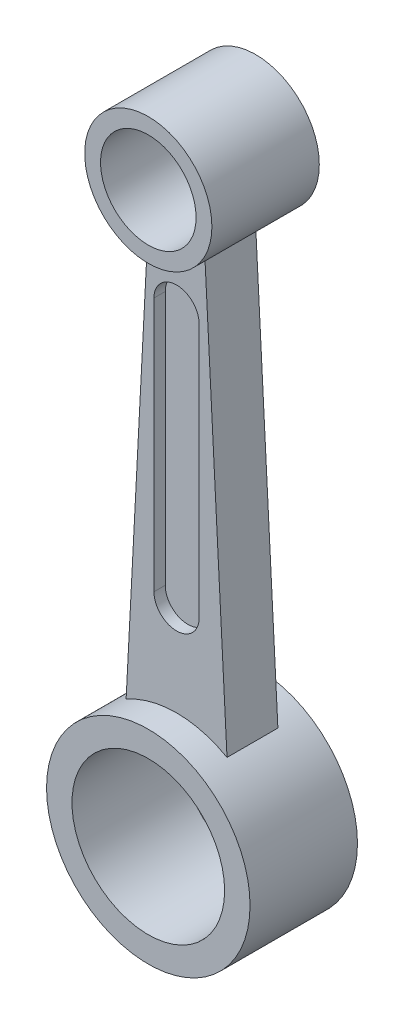
ISO-10303-21;
HEADER;
FILE_DESCRIPTION(('STEP AP214'),'2;1');
FILE_NAME('part.step','',(''),(''),'','','');
FILE_SCHEMA(('AUTOMOTIVE_DESIGN { 1 0 10303 214 1 1 1 1 }'));
ENDSEC;
DATA;
#1=APPLICATION_CONTEXT('core data for automotive mechanical design processes');
#2=APPLICATION_PROTOCOL_DEFINITION('international standard','automotive_design',2000,#1);
#3=PRODUCT_CONTEXT('',#1,'mechanical');
#4=PRODUCT('Part','Part','',(#3));
#5=PRODUCT_RELATED_PRODUCT_CATEGORY('part','',(#4));
#6=PRODUCT_DEFINITION_FORMATION('','',#4);
#7=PRODUCT_DEFINITION_CONTEXT('part definition',#1,'design');
#8=PRODUCT_DEFINITION('design','',#6,#7);
#9=PRODUCT_DEFINITION_SHAPE('','',#8);
#10=(LENGTH_UNIT() NAMED_UNIT(*) SI_UNIT(.MILLI.,.METRE.));
#11=(NAMED_UNIT(*) PLANE_ANGLE_UNIT() SI_UNIT($,.RADIAN.));
#12=(NAMED_UNIT(*) SI_UNIT($,.STERADIAN.) SOLID_ANGLE_UNIT());
#13=UNCERTAINTY_MEASURE_WITH_UNIT(LENGTH_MEASURE(1.E-05),#10,'distance_accuracy_value','');
#14=(GEOMETRIC_REPRESENTATION_CONTEXT(3) GLOBAL_UNCERTAINTY_ASSIGNED_CONTEXT((#13)) GLOBAL_UNIT_ASSIGNED_CONTEXT((#10,
#11,#12)) REPRESENTATION_CONTEXT('',''));
#15=CARTESIAN_POINT('',(0.,0.,0.));
#16=DIRECTION('',(0.,0.,1.));
#17=DIRECTION('',(1.,0.,0.));
#18=AXIS2_PLACEMENT_3D('',#15,#16,#17);
#19=CARTESIAN_POINT('',(0.,0.,-9.));
#20=DIRECTION('',(0.,0.,1.));
#21=DIRECTION('',(1.,0.,0.));
#22=AXIS2_PLACEMENT_3D('',#19,#20,#21);
#23=PLANE('',#22);
#24=CARTESIAN_POINT('',(0.,-201.2,-9.));
#25=DIRECTION('',(0.,0.,1.));
#26=DIRECTION('',(1.,0.,0.));
#27=AXIS2_PLACEMENT_3D('',#24,#25,#26);
#28=CIRCLE('',#27,36.);
#29=CARTESIAN_POINT('',(17.8496972125887,-169.93678984143,-9.));
#30=VERTEX_POINT('',#29);
#31=CARTESIAN_POINT('',(-17.8496972125887,-169.93678984143,-9.));
#32=VERTEX_POINT('',#31);
#33=EDGE_CURVE('E239',#30,#32,#28,.T.);
#34=ORIENTED_EDGE('',*,*,#33,.T.);
#35=DIRECTION('',(-0.0523359562429438,-0.998629534754574,0.));
#36=VECTOR('',#35,1.);
#37=CARTESIAN_POINT('',(-8.91919021071964,0.467434951946856,-9.));
#38=LINE('',#37,#36);
#39=CARTESIAN_POINT('',(-10.,-20.1556443707464,-9.));
#40=VERTEX_POINT('',#39);
#41=EDGE_CURVE('E250',#40,#32,#38,.T.);
#42=ORIENTED_EDGE('',*,*,#41,.F.);
#43=CARTESIAN_POINT('',(0.,0.,-9.));
#44=DIRECTION('',(0.,0.,1.));
#45=DIRECTION('',(1.,0.,0.));
#46=AXIS2_PLACEMENT_3D('',#43,#44,#45);
#47=CIRCLE('',#46,22.5);
#48=CARTESIAN_POINT('',(10.,-20.1556443707464,-9.));
#49=VERTEX_POINT('',#48);
#50=EDGE_CURVE('E269',#40,#49,#47,.T.);
#51=ORIENTED_EDGE('',*,*,#50,.T.);
#52=DIRECTION('',(0.052335956242944,-0.998629534754574,0.));
#53=VECTOR('',#52,1.);
#54=CARTESIAN_POINT('',(8.91919021071964,0.467434951946858,-9.));
#55=LINE('',#54,#53);
#56=EDGE_CURVE('E265',#49,#30,#55,.T.);
#57=ORIENTED_EDGE('',*,*,#56,.T.);
#58=EDGE_LOOP('',(#34,#42,#51,#57));
#59=FACE_BOUND('',#58,.T.);
#60=CARTESIAN_POINT('',(0.,-132.1,-9.));
#61=DIRECTION('',(0.,0.,1.));
#62=DIRECTION('',(1.,0.,0.));
#63=AXIS2_PLACEMENT_3D('',#60,#61,#62);
#64=CIRCLE('',#63,8.);
#65=CARTESIAN_POINT('',(-8.,-132.1,-9.));
#66=VERTEX_POINT('',#65);
#67=CARTESIAN_POINT('',(8.,-132.1,-9.));
#68=VERTEX_POINT('',#67);
#69=EDGE_CURVE('E63',#66,#68,#64,.T.);
#70=ORIENTED_EDGE('',*,*,#69,.T.);
#71=DIRECTION('',(0.,1.,0.));
#72=VECTOR('',#71,1.);
#73=CARTESIAN_POINT('',(8.,-132.1,-9.));
#74=LINE('',#73,#72);
#75=CARTESIAN_POINT('',(8.00000000000001,-42.1,-9.));
#76=VERTEX_POINT('',#75);
#77=EDGE_CURVE('E160',#68,#76,#74,.T.);
#78=ORIENTED_EDGE('',*,*,#77,.T.);
#79=CARTESIAN_POINT('',(0.,-42.1,-9.));
#80=DIRECTION('',(0.,0.,1.));
#81=DIRECTION('',(1.,0.,0.));
#82=AXIS2_PLACEMENT_3D('',#79,#80,#81);
#83=CIRCLE('',#82,8.);
#84=CARTESIAN_POINT('',(-7.99999999999999,-42.1,-9.));
#85=VERTEX_POINT('',#84);
#86=EDGE_CURVE('E164',#76,#85,#83,.T.);
#87=ORIENTED_EDGE('',*,*,#86,.T.);
#88=DIRECTION('',(0.,-1.,0.));
#89=VECTOR('',#88,1.);
#90=CARTESIAN_POINT('',(-8.,-132.1,-9.));
#91=LINE('',#90,#89);
#92=EDGE_CURVE('E173',#85,#66,#91,.T.);
#93=ORIENTED_EDGE('',*,*,#92,.T.);
#94=EDGE_LOOP('',(#70,#78,#87,#93));
#95=FACE_BOUND('',#94,.T.);
#96=ADVANCED_FACE('F45',(#59,#95),#23,.F.);
#97=CARTESIAN_POINT('',(0.,0.,19.));
#98=DIRECTION('',(0.,0.,-1.));
#99=DIRECTION('',(-1.,0.,0.));
#100=AXIS2_PLACEMENT_3D('',#97,#98,#99);
#101=CYLINDRICAL_SURFACE('',#100,22.5);
#102=DIRECTION('',(0.,0.,-1.));
#103=VECTOR('',#102,1.);
#104=CARTESIAN_POINT('',(-10.,-20.1556443707464,9.));
#105=LINE('',#104,#103);
#106=CARTESIAN_POINT('',(-10.,-20.1556443707464,9.));
#107=VERTEX_POINT('',#106);
#108=EDGE_CURVE('E278',#107,#40,#105,.T.);
#109=ORIENTED_EDGE('',*,*,#108,.F.);
#110=CARTESIAN_POINT('',(0.,0.,9.));
#111=DIRECTION('',(0.,0.,1.));
#112=DIRECTION('',(1.,0.,0.));
#113=AXIS2_PLACEMENT_3D('',#110,#111,#112);
#114=CIRCLE('',#113,22.5);
#115=CARTESIAN_POINT('',(10.,-20.1556443707464,9.));
#116=VERTEX_POINT('',#115);
#117=EDGE_CURVE('E254',#107,#116,#114,.T.);
#118=ORIENTED_EDGE('',*,*,#117,.T.);
#119=DIRECTION('',(0.,0.,-1.));
#120=VECTOR('',#119,1.);
#121=CARTESIAN_POINT('',(10.,-20.1556443707464,9.));
#122=LINE('',#121,#120);
#123=EDGE_CURVE('E282',#116,#49,#122,.T.);
#124=ORIENTED_EDGE('',*,*,#123,.T.);
#125=ORIENTED_EDGE('',*,*,#50,.F.);
#126=EDGE_LOOP('',(#109,#118,#124,#125));
#127=FACE_BOUND('',#126,.T.);
#128=CARTESIAN_POINT('',(0.,0.,19.));
#129=DIRECTION('',(0.,0.,1.));
#130=DIRECTION('',(1.,0.,0.));
#131=AXIS2_PLACEMENT_3D('',#128,#129,#130);
#132=CIRCLE('',#131,22.5);
#133=CARTESIAN_POINT('',(22.5,0.,19.));
#134=VERTEX_POINT('',#133);
#135=EDGE_CURVE('E55',#134,#134,#132,.T.);
#136=ORIENTED_EDGE('',*,*,#135,.F.);
#137=EDGE_LOOP('',(#136));
#138=FACE_BOUND('',#137,.T.);
#139=CARTESIAN_POINT('',(0.,0.,-19.));
#140=DIRECTION('',(0.,0.,1.));
#141=DIRECTION('',(1.,0.,0.));
#142=AXIS2_PLACEMENT_3D('',#139,#140,#141);
#143=CIRCLE('',#142,22.5);
#144=CARTESIAN_POINT('',(22.5,0.,-19.));
#145=VERTEX_POINT('',#144);
#146=EDGE_CURVE('E289',#145,#145,#143,.T.);
#147=ORIENTED_EDGE('',*,*,#146,.T.);
#148=EDGE_LOOP('',(#147));
#149=FACE_BOUND('',#148,.T.);
#150=ADVANCED_FACE('F47',(#127,#138,#149),#101,.T.);
#151=CARTESIAN_POINT('',(0.,0.,19.));
#152=DIRECTION('',(0.,0.,-1.));
#153=DIRECTION('',(-1.,0.,0.));
#154=AXIS2_PLACEMENT_3D('',#151,#152,#153);
#155=CYLINDRICAL_SURFACE('',#154,16.9);
#156=CARTESIAN_POINT('',(0.,0.,19.));
#157=DIRECTION('',(0.,0.,1.));
#158=DIRECTION('',(1.,0.,0.));
#159=AXIS2_PLACEMENT_3D('',#156,#157,#158);
#160=CIRCLE('',#159,16.9);
#161=CARTESIAN_POINT('',(16.9,0.,19.));
#162=VERTEX_POINT('',#161);
#163=EDGE_CURVE('E11',#162,#162,#160,.T.);
#164=ORIENTED_EDGE('',*,*,#163,.T.);
#165=EDGE_LOOP('',(#164));
#166=FACE_BOUND('',#165,.T.);
#167=CARTESIAN_POINT('',(0.,0.,-19.));
#168=DIRECTION('',(0.,0.,1.));
#169=DIRECTION('',(1.,0.,0.));
#170=AXIS2_PLACEMENT_3D('',#167,#168,#169);
#171=CIRCLE('',#170,16.9);
#172=CARTESIAN_POINT('',(16.9,0.,-19.));
#173=VERTEX_POINT('',#172);
#174=EDGE_CURVE('E49',#173,#173,#171,.T.);
#175=ORIENTED_EDGE('',*,*,#174,.F.);
#176=EDGE_LOOP('',(#175));
#177=FACE_BOUND('',#176,.T.);
#178=ADVANCED_FACE('F302',(#166,#177),#155,.F.);
#179=CARTESIAN_POINT('',(0.,0.,19.));
#180=DIRECTION('',(0.,0.,1.));
#181=DIRECTION('',(1.,0.,0.));
#182=AXIS2_PLACEMENT_3D('',#179,#180,#181);
#183=PLANE('',#182);
#184=ORIENTED_EDGE('',*,*,#135,.T.);
#185=EDGE_LOOP('',(#184));
#186=FACE_BOUND('',#185,.T.);
#187=ORIENTED_EDGE('',*,*,#163,.F.);
#188=EDGE_LOOP('',(#187));
#189=FACE_BOUND('',#188,.T.);
#190=ADVANCED_FACE('F304',(#186,#189),#183,.T.);
#191=CARTESIAN_POINT('',(0.,0.,-19.));
#192=DIRECTION('',(0.,0.,1.));
#193=DIRECTION('',(1.,0.,0.));
#194=AXIS2_PLACEMENT_3D('',#191,#192,#193);
#195=PLANE('',#194);
#196=ORIENTED_EDGE('',*,*,#146,.F.);
#197=EDGE_LOOP('',(#196));
#198=FACE_BOUND('',#197,.T.);
#199=ORIENTED_EDGE('',*,*,#174,.T.);
#200=EDGE_LOOP('',(#199));
#201=FACE_BOUND('',#200,.T.);
#202=ADVANCED_FACE('F300',(#198,#201),#195,.F.);
#203=CARTESIAN_POINT('',(8.91919021071964,0.467434951946858,9.));
#204=DIRECTION('',(0.998629534754574,0.052335956242944,0.));
#205=DIRECTION('',(-0.052335956242944,0.998629534754574,0.));
#206=AXIS2_PLACEMENT_3D('',#203,#204,#205);
#207=PLANE('',#206);
#208=ORIENTED_EDGE('',*,*,#56,.F.);
#209=ORIENTED_EDGE('',*,*,#123,.F.);
#210=DIRECTION('',(0.052335956242944,-0.998629534754574,0.));
#211=VECTOR('',#210,1.);
#212=CARTESIAN_POINT('',(8.91919021071964,0.467434951946858,9.));
#213=LINE('',#212,#211);
#214=CARTESIAN_POINT('',(17.8496972125887,-169.93678984143,9.));
#215=VERTEX_POINT('',#214);
#216=EDGE_CURVE('E249',#116,#215,#213,.T.);
#217=ORIENTED_EDGE('',*,*,#216,.T.);
#218=DIRECTION('',(0.,0.,-1.));
#219=VECTOR('',#218,1.);
#220=CARTESIAN_POINT('',(17.8496972125887,-169.93678984143,9.));
#221=LINE('',#220,#219);
#222=EDGE_CURVE('E285',#215,#30,#221,.T.);
#223=ORIENTED_EDGE('',*,*,#222,.T.);
#224=EDGE_LOOP('',(#208,#209,#217,#223));
#225=FACE_BOUND('',#224,.T.);
#226=ADVANCED_FACE('F329',(#225),#207,.T.);
#227=CARTESIAN_POINT('',(-8.91919021071964,0.467434951946856,9.));
#228=DIRECTION('',(0.998629534754574,-0.0523359562429438,0.));
#229=DIRECTION('',(0.0523359562429438,0.998629534754574,0.));
#230=AXIS2_PLACEMENT_3D('',#227,#228,#229);
#231=PLANE('',#230);
#232=ORIENTED_EDGE('',*,*,#41,.T.);
#233=DIRECTION('',(0.,0.,-1.));
#234=VECTOR('',#233,1.);
#235=CARTESIAN_POINT('',(-17.8496972125887,-169.93678984143,9.));
#236=LINE('',#235,#234);
#237=CARTESIAN_POINT('',(-17.8496972125887,-169.93678984143,9.));
#238=VERTEX_POINT('',#237);
#239=EDGE_CURVE('E261',#238,#32,#236,.T.);
#240=ORIENTED_EDGE('',*,*,#239,.F.);
#241=DIRECTION('',(-0.0523359562429438,-0.998629534754574,0.));
#242=VECTOR('',#241,1.);
#243=CARTESIAN_POINT('',(-8.91919021071964,0.467434951946856,9.));
#244=LINE('',#243,#242);
#245=EDGE_CURVE('E257',#107,#238,#244,.T.);
#246=ORIENTED_EDGE('',*,*,#245,.F.);
#247=ORIENTED_EDGE('',*,*,#108,.T.);
#248=EDGE_LOOP('',(#232,#240,#246,#247));
#249=FACE_BOUND('',#248,.T.);
#250=ADVANCED_FACE('F326',(#249),#231,.F.);
#251=CARTESIAN_POINT('',(0.,0.,9.));
#252=DIRECTION('',(0.,0.,1.));
#253=DIRECTION('',(1.,0.,0.));
#254=AXIS2_PLACEMENT_3D('',#251,#252,#253);
#255=PLANE('',#254);
#256=CARTESIAN_POINT('',(0.,-132.1,9.));
#257=DIRECTION('',(0.,0.,1.));
#258=DIRECTION('',(1.,0.,0.));
#259=AXIS2_PLACEMENT_3D('',#256,#257,#258);
#260=CIRCLE('',#259,8.);
#261=CARTESIAN_POINT('',(-8.,-132.1,9.));
#262=VERTEX_POINT('',#261);
#263=CARTESIAN_POINT('',(8.,-132.1,9.));
#264=VERTEX_POINT('',#263);
#265=EDGE_CURVE('E71',#262,#264,#260,.T.);
#266=ORIENTED_EDGE('',*,*,#265,.F.);
#267=DIRECTION('',(0.,-1.,0.));
#268=VECTOR('',#267,1.);
#269=CARTESIAN_POINT('',(-8.,-132.1,9.));
#270=LINE('',#269,#268);
#271=CARTESIAN_POINT('',(-7.99999999999999,-42.1,9.));
#272=VERTEX_POINT('',#271);
#273=EDGE_CURVE('E192',#272,#262,#270,.T.);
#274=ORIENTED_EDGE('',*,*,#273,.F.);
#275=CARTESIAN_POINT('',(0.,-42.1,9.));
#276=DIRECTION('',(0.,0.,1.));
#277=DIRECTION('',(1.,0.,0.));
#278=AXIS2_PLACEMENT_3D('',#275,#276,#277);
#279=CIRCLE('',#278,8.);
#280=CARTESIAN_POINT('',(8.00000000000001,-42.1,9.));
#281=VERTEX_POINT('',#280);
#282=EDGE_CURVE('E211',#281,#272,#279,.T.);
#283=ORIENTED_EDGE('',*,*,#282,.F.);
#284=DIRECTION('',(0.,1.,0.));
#285=VECTOR('',#284,1.);
#286=CARTESIAN_POINT('',(8.,-132.1,9.));
#287=LINE('',#286,#285);
#288=EDGE_CURVE('E207',#264,#281,#287,.T.);
#289=ORIENTED_EDGE('',*,*,#288,.F.);
#290=EDGE_LOOP('',(#266,#274,#283,#289));
#291=FACE_BOUND('',#290,.T.);
#292=CARTESIAN_POINT('',(0.,-201.2,9.));
#293=DIRECTION('',(0.,0.,1.));
#294=DIRECTION('',(1.,0.,0.));
#295=AXIS2_PLACEMENT_3D('',#292,#293,#294);
#296=CIRCLE('',#295,36.);
#297=EDGE_CURVE('E246',#215,#238,#296,.T.);
#298=ORIENTED_EDGE('',*,*,#297,.F.);
#299=ORIENTED_EDGE('',*,*,#216,.F.);
#300=ORIENTED_EDGE('',*,*,#117,.F.);
#301=ORIENTED_EDGE('',*,*,#245,.T.);
#302=EDGE_LOOP('',(#298,#299,#300,#301));
#303=FACE_BOUND('',#302,.T.);
#304=ADVANCED_FACE('F324',(#291,#303),#255,.T.);
#305=CARTESIAN_POINT('',(0.,-201.2,19.));
#306=DIRECTION('',(0.,0.,-1.));
#307=DIRECTION('',(-1.,0.,0.));
#308=AXIS2_PLACEMENT_3D('',#305,#306,#307);
#309=CYLINDRICAL_SURFACE('',#308,27.);
#310=CARTESIAN_POINT('',(0.,-201.2,19.));
#311=DIRECTION('',(0.,0.,1.));
#312=DIRECTION('',(1.,0.,0.));
#313=AXIS2_PLACEMENT_3D('',#310,#311,#312);
#314=CIRCLE('',#313,27.);
#315=CARTESIAN_POINT('',(27.,-201.2,19.));
#316=VERTEX_POINT('',#315);
#317=EDGE_CURVE('E230',#316,#316,#314,.T.);
#318=ORIENTED_EDGE('',*,*,#317,.T.);
#319=EDGE_LOOP('',(#318));
#320=FACE_BOUND('',#319,.T.);
#321=CARTESIAN_POINT('',(0.,-201.2,-19.));
#322=DIRECTION('',(0.,0.,1.));
#323=DIRECTION('',(1.,0.,0.));
#324=AXIS2_PLACEMENT_3D('',#321,#322,#323);
#325=CIRCLE('',#324,27.);
#326=CARTESIAN_POINT('',(27.,-201.2,-19.));
#327=VERTEX_POINT('',#326);
#328=EDGE_CURVE('E221',#327,#327,#325,.T.);
#329=ORIENTED_EDGE('',*,*,#328,.F.);
#330=EDGE_LOOP('',(#329));
#331=FACE_BOUND('',#330,.T.);
#332=ADVANCED_FACE('F361',(#320,#331),#309,.F.);
#333=CARTESIAN_POINT('',(0.,-201.2,19.));
#334=DIRECTION('',(0.,0.,-1.));
#335=DIRECTION('',(-1.,0.,0.));
#336=AXIS2_PLACEMENT_3D('',#333,#334,#335);
#337=CYLINDRICAL_SURFACE('',#336,36.);
#338=ORIENTED_EDGE('',*,*,#297,.T.);
#339=ORIENTED_EDGE('',*,*,#239,.T.);
#340=ORIENTED_EDGE('',*,*,#33,.F.);
#341=ORIENTED_EDGE('',*,*,#222,.F.);
#342=EDGE_LOOP('',(#338,#339,#340,#341));
#343=FACE_BOUND('',#342,.T.);
#344=CARTESIAN_POINT('',(0.,-201.2,19.));
#345=DIRECTION('',(0.,0.,1.));
#346=DIRECTION('',(1.,0.,0.));
#347=AXIS2_PLACEMENT_3D('',#344,#345,#346);
#348=CIRCLE('',#347,36.);
#349=CARTESIAN_POINT('',(36.,-201.2,19.));
#350=VERTEX_POINT('',#349);
#351=EDGE_CURVE('E234',#350,#350,#348,.T.);
#352=ORIENTED_EDGE('',*,*,#351,.F.);
#353=EDGE_LOOP('',(#352));
#354=FACE_BOUND('',#353,.T.);
#355=CARTESIAN_POINT('',(0.,-201.2,-19.));
#356=DIRECTION('',(0.,0.,1.));
#357=DIRECTION('',(1.,0.,0.));
#358=AXIS2_PLACEMENT_3D('',#355,#356,#357);
#359=CIRCLE('',#358,36.);
#360=CARTESIAN_POINT('',(36.,-201.2,-19.));
#361=VERTEX_POINT('',#360);
#362=EDGE_CURVE('E235',#361,#361,#359,.T.);
#363=ORIENTED_EDGE('',*,*,#362,.T.);
#364=EDGE_LOOP('',(#363));
#365=FACE_BOUND('',#364,.T.);
#366=ADVANCED_FACE('F365',(#343,#354,#365),#337,.T.);
#367=CARTESIAN_POINT('',(0.,0.,19.));
#368=DIRECTION('',(0.,0.,1.));
#369=DIRECTION('',(1.,0.,0.));
#370=AXIS2_PLACEMENT_3D('',#367,#368,#369);
#371=PLANE('',#370);
#372=ORIENTED_EDGE('',*,*,#317,.F.);
#373=EDGE_LOOP('',(#372));
#374=FACE_BOUND('',#373,.T.);
#375=ORIENTED_EDGE('',*,*,#351,.T.);
#376=EDGE_LOOP('',(#375));
#377=FACE_BOUND('',#376,.T.);
#378=ADVANCED_FACE('F371',(#374,#377),#371,.T.);
#379=CARTESIAN_POINT('',(0.,0.,-19.));
#380=DIRECTION('',(0.,0.,1.));
#381=DIRECTION('',(1.,0.,0.));
#382=AXIS2_PLACEMENT_3D('',#379,#380,#381);
#383=PLANE('',#382);
#384=ORIENTED_EDGE('',*,*,#328,.T.);
#385=EDGE_LOOP('',(#384));
#386=FACE_BOUND('',#385,.T.);
#387=ORIENTED_EDGE('',*,*,#362,.F.);
#388=EDGE_LOOP('',(#387));
#389=FACE_BOUND('',#388,.T.);
#390=ADVANCED_FACE('F379',(#386,#389),#383,.F.);
#391=CARTESIAN_POINT('',(0.,-132.1,5.));
#392=DIRECTION('',(0.,0.,1.));
#393=DIRECTION('',(1.,0.,0.));
#394=AXIS2_PLACEMENT_3D('',#391,#392,#393);
#395=CYLINDRICAL_SURFACE('',#394,8.);
#396=ORIENTED_EDGE('',*,*,#265,.T.);
#397=DIRECTION('',(0.,0.,1.));
#398=VECTOR('',#397,1.);
#399=CARTESIAN_POINT('',(8.,-132.1,5.));
#400=LINE('',#399,#398);
#401=CARTESIAN_POINT('',(8.,-132.1,5.));
#402=VERTEX_POINT('',#401);
#403=EDGE_CURVE('E204',#402,#264,#400,.T.);
#404=ORIENTED_EDGE('',*,*,#403,.F.);
#405=CARTESIAN_POINT('',(0.,-132.1,5.));
#406=DIRECTION('',(0.,0.,1.));
#407=DIRECTION('',(1.,0.,0.));
#408=AXIS2_PLACEMENT_3D('',#405,#406,#407);
#409=CIRCLE('',#408,8.);
#410=CARTESIAN_POINT('',(-8.,-132.1,5.));
#411=VERTEX_POINT('',#410);
#412=EDGE_CURVE('E187',#411,#402,#409,.T.);
#413=ORIENTED_EDGE('',*,*,#412,.F.);
#414=DIRECTION('',(0.,0.,1.));
#415=VECTOR('',#414,1.);
#416=CARTESIAN_POINT('',(-8.,-132.1,5.));
#417=LINE('',#416,#415);
#418=EDGE_CURVE('E218',#411,#262,#417,.T.);
#419=ORIENTED_EDGE('',*,*,#418,.T.);
#420=EDGE_LOOP('',(#396,#404,#413,#419));
#421=FACE_BOUND('',#420,.T.);
#422=ADVANCED_FACE('F387',(#421),#395,.F.);
#423=CARTESIAN_POINT('',(-8.,-132.1,5.));
#424=DIRECTION('',(-1.,0.,0.));
#425=DIRECTION('',(0.,-1.,0.));
#426=AXIS2_PLACEMENT_3D('',#423,#424,#425);
#427=PLANE('',#426);
#428=ORIENTED_EDGE('',*,*,#273,.T.);
#429=ORIENTED_EDGE('',*,*,#418,.F.);
#430=DIRECTION('',(0.,-1.,0.));
#431=VECTOR('',#430,1.);
#432=CARTESIAN_POINT('',(-8.,-132.1,5.));
#433=LINE('',#432,#431);
#434=CARTESIAN_POINT('',(-7.99999999999999,-42.1,5.));
#435=VERTEX_POINT('',#434);
#436=EDGE_CURVE('E200',#435,#411,#433,.T.);
#437=ORIENTED_EDGE('',*,*,#436,.F.);
#438=DIRECTION('',(0.,0.,1.));
#439=VECTOR('',#438,1.);
#440=CARTESIAN_POINT('',(-7.99999999999999,-42.1,5.));
#441=LINE('',#440,#439);
#442=EDGE_CURVE('E222',#435,#272,#441,.T.);
#443=ORIENTED_EDGE('',*,*,#442,.T.);
#444=EDGE_LOOP('',(#428,#429,#437,#443));
#445=FACE_BOUND('',#444,.T.);
#446=ADVANCED_FACE('F400',(#445),#427,.F.);
#447=CARTESIAN_POINT('',(0.,-42.1,5.));
#448=DIRECTION('',(0.,0.,1.));
#449=DIRECTION('',(1.,0.,0.));
#450=AXIS2_PLACEMENT_3D('',#447,#448,#449);
#451=CYLINDRICAL_SURFACE('',#450,8.);
#452=ORIENTED_EDGE('',*,*,#282,.T.);
#453=ORIENTED_EDGE('',*,*,#442,.F.);
#454=CARTESIAN_POINT('',(0.,-42.1,5.));
#455=DIRECTION('',(0.,0.,1.));
#456=DIRECTION('',(1.,0.,0.));
#457=AXIS2_PLACEMENT_3D('',#454,#455,#456);
#458=CIRCLE('',#457,8.);
#459=CARTESIAN_POINT('',(8.00000000000001,-42.1,5.));
#460=VERTEX_POINT('',#459);
#461=EDGE_CURVE('E196',#460,#435,#458,.T.);
#462=ORIENTED_EDGE('',*,*,#461,.F.);
#463=DIRECTION('',(0.,0.,1.));
#464=VECTOR('',#463,1.);
#465=CARTESIAN_POINT('',(8.00000000000001,-42.1,5.));
#466=LINE('',#465,#464);
#467=EDGE_CURVE('E225',#460,#281,#466,.T.);
#468=ORIENTED_EDGE('',*,*,#467,.T.);
#469=EDGE_LOOP('',(#452,#453,#462,#468));
#470=FACE_BOUND('',#469,.T.);
#471=ADVANCED_FACE('F408',(#470),#451,.F.);
#472=CARTESIAN_POINT('',(8.,-132.1,5.));
#473=DIRECTION('',(1.,0.,0.));
#474=DIRECTION('',(0.,1.,0.));
#475=AXIS2_PLACEMENT_3D('',#472,#473,#474);
#476=PLANE('',#475);
#477=ORIENTED_EDGE('',*,*,#288,.T.);
#478=ORIENTED_EDGE('',*,*,#467,.F.);
#479=DIRECTION('',(0.,1.,0.));
#480=VECTOR('',#479,1.);
#481=CARTESIAN_POINT('',(8.,-132.1,5.));
#482=LINE('',#481,#480);
#483=EDGE_CURVE('E191',#402,#460,#482,.T.);
#484=ORIENTED_EDGE('',*,*,#483,.F.);
#485=ORIENTED_EDGE('',*,*,#403,.T.);
#486=EDGE_LOOP('',(#477,#478,#484,#485));
#487=FACE_BOUND('',#486,.T.);
#488=ADVANCED_FACE('F417',(#487),#476,.F.);
#489=CARTESIAN_POINT('',(0.,-132.1,5.));
#490=DIRECTION('',(0.,0.,1.));
#491=DIRECTION('',(1.,0.,0.));
#492=AXIS2_PLACEMENT_3D('',#489,#490,#491);
#493=PLANE('',#492);
#494=ORIENTED_EDGE('',*,*,#412,.T.);
#495=ORIENTED_EDGE('',*,*,#483,.T.);
#496=ORIENTED_EDGE('',*,*,#461,.T.);
#497=ORIENTED_EDGE('',*,*,#436,.T.);
#498=EDGE_LOOP('',(#494,#495,#496,#497));
#499=FACE_BOUND('',#498,.T.);
#500=ADVANCED_FACE('F425',(#499),#493,.T.);
#501=CARTESIAN_POINT('',(0.,-132.1,-5.));
#502=DIRECTION('',(0.,0.,-1.));
#503=DIRECTION('',(-1.,0.,0.));
#504=AXIS2_PLACEMENT_3D('',#501,#502,#503);
#505=CYLINDRICAL_SURFACE('',#504,8.);
#506=ORIENTED_EDGE('',*,*,#69,.F.);
#507=DIRECTION('',(0.,0.,-1.));
#508=VECTOR('',#507,1.);
#509=CARTESIAN_POINT('',(-8.,-132.1,-5.));
#510=LINE('',#509,#508);
#511=CARTESIAN_POINT('',(-8.,-132.1,-5.));
#512=VERTEX_POINT('',#511);
#513=EDGE_CURVE('E142',#512,#66,#510,.T.);
#514=ORIENTED_EDGE('',*,*,#513,.F.);
#515=CARTESIAN_POINT('',(0.,-132.1,-5.));
#516=DIRECTION('',(0.,0.,1.));
#517=DIRECTION('',(1.,0.,0.));
#518=AXIS2_PLACEMENT_3D('',#515,#516,#517);
#519=CIRCLE('',#518,8.);
#520=CARTESIAN_POINT('',(8.,-132.1,-5.));
#521=VERTEX_POINT('',#520);
#522=EDGE_CURVE('E150',#512,#521,#519,.T.);
#523=ORIENTED_EDGE('',*,*,#522,.T.);
#524=DIRECTION('',(0.,0.,-1.));
#525=VECTOR('',#524,1.);
#526=CARTESIAN_POINT('',(8.,-132.1,-5.));
#527=LINE('',#526,#525);
#528=EDGE_CURVE('E179',#521,#68,#527,.T.);
#529=ORIENTED_EDGE('',*,*,#528,.T.);
#530=EDGE_LOOP('',(#506,#514,#523,#529));
#531=FACE_BOUND('',#530,.T.);
#532=ADVANCED_FACE('F153',(#531),#505,.F.);
#533=CARTESIAN_POINT('',(8.,-132.1,-5.));
#534=DIRECTION('',(-1.,0.,0.));
#535=DIRECTION('',(0.,-1.,0.));
#536=AXIS2_PLACEMENT_3D('',#533,#534,#535);
#537=PLANE('',#536);
#538=ORIENTED_EDGE('',*,*,#77,.F.);
#539=ORIENTED_EDGE('',*,*,#528,.F.);
#540=DIRECTION('',(0.,1.,0.));
#541=VECTOR('',#540,1.);
#542=CARTESIAN_POINT('',(8.,-132.1,-5.));
#543=LINE('',#542,#541);
#544=CARTESIAN_POINT('',(8.00000000000001,-42.1,-5.));
#545=VERTEX_POINT('',#544);
#546=EDGE_CURVE('E156',#521,#545,#543,.T.);
#547=ORIENTED_EDGE('',*,*,#546,.T.);
#548=DIRECTION('',(0.,0.,-1.));
#549=VECTOR('',#548,1.);
#550=CARTESIAN_POINT('',(8.00000000000001,-42.1,-5.));
#551=LINE('',#550,#549);
#552=EDGE_CURVE('E182',#545,#76,#551,.T.);
#553=ORIENTED_EDGE('',*,*,#552,.T.);
#554=EDGE_LOOP('',(#538,#539,#547,#553));
#555=FACE_BOUND('',#554,.T.);
#556=ADVANCED_FACE('F451',(#555),#537,.T.);
#557=CARTESIAN_POINT('',(0.,-42.1,-5.));
#558=DIRECTION('',(0.,0.,-1.));
#559=DIRECTION('',(-1.,0.,0.));
#560=AXIS2_PLACEMENT_3D('',#557,#558,#559);
#561=CYLINDRICAL_SURFACE('',#560,8.);
#562=ORIENTED_EDGE('',*,*,#86,.F.);
#563=ORIENTED_EDGE('',*,*,#552,.F.);
#564=CARTESIAN_POINT('',(0.,-42.1,-5.));
#565=DIRECTION('',(0.,0.,1.));
#566=DIRECTION('',(1.,0.,0.));
#567=AXIS2_PLACEMENT_3D('',#564,#565,#566);
#568=CIRCLE('',#567,8.);
#569=CARTESIAN_POINT('',(-7.99999999999999,-42.1,-5.));
#570=VERTEX_POINT('',#569);
#571=EDGE_CURVE('E149',#545,#570,#568,.T.);
#572=ORIENTED_EDGE('',*,*,#571,.T.);
#573=DIRECTION('',(0.,0.,-1.));
#574=VECTOR('',#573,1.);
#575=CARTESIAN_POINT('',(-7.99999999999999,-42.1,-5.));
#576=LINE('',#575,#574);
#577=EDGE_CURVE('E144',#570,#85,#576,.T.);
#578=ORIENTED_EDGE('',*,*,#577,.T.);
#579=EDGE_LOOP('',(#562,#563,#572,#578));
#580=FACE_BOUND('',#579,.T.);
#581=ADVANCED_FACE('F460',(#580),#561,.F.);
#582=CARTESIAN_POINT('',(-8.,-132.1,-5.));
#583=DIRECTION('',(1.,0.,0.));
#584=DIRECTION('',(0.,1.,0.));
#585=AXIS2_PLACEMENT_3D('',#582,#583,#584);
#586=PLANE('',#585);
#587=ORIENTED_EDGE('',*,*,#92,.F.);
#588=ORIENTED_EDGE('',*,*,#577,.F.);
#589=DIRECTION('',(0.,-1.,0.));
#590=VECTOR('',#589,1.);
#591=CARTESIAN_POINT('',(-8.,-132.1,-5.));
#592=LINE('',#591,#590);
#593=EDGE_CURVE('E139',#570,#512,#592,.T.);
#594=ORIENTED_EDGE('',*,*,#593,.T.);
#595=ORIENTED_EDGE('',*,*,#513,.T.);
#596=EDGE_LOOP('',(#587,#588,#594,#595));
#597=FACE_BOUND('',#596,.T.);
#598=ADVANCED_FACE('F141',(#597),#586,.T.);
#599=CARTESIAN_POINT('',(0.,-132.1,-5.));
#600=DIRECTION('',(0.,0.,-1.));
#601=DIRECTION('',(1.,0.,0.));
#602=AXIS2_PLACEMENT_3D('',#599,#600,#601);
#603=PLANE('',#602);
#604=ORIENTED_EDGE('',*,*,#522,.F.);
#605=ORIENTED_EDGE('',*,*,#593,.F.);
#606=ORIENTED_EDGE('',*,*,#571,.F.);
#607=ORIENTED_EDGE('',*,*,#546,.F.);
#608=EDGE_LOOP('',(#604,#605,#606,#607));
#609=FACE_BOUND('',#608,.T.);
#610=ADVANCED_FACE('F158',(#609),#603,.T.);
#611=CLOSED_SHELL('',(#96,#150,#178,#190,#202,#226,#250,#304,#332,#366,#378,#390,#422,#446,#471,
#488,#500,#532,#556,#581,#598,#610));
#612=MANIFOLD_SOLID_BREP('B2',#611);
#613=ADVANCED_BREP_SHAPE_REPRESENTATION('',(#18,#612),#14);
#614=SHAPE_DEFINITION_REPRESENTATION(#9,#613);
ENDSEC;
END-ISO-10303-21;
